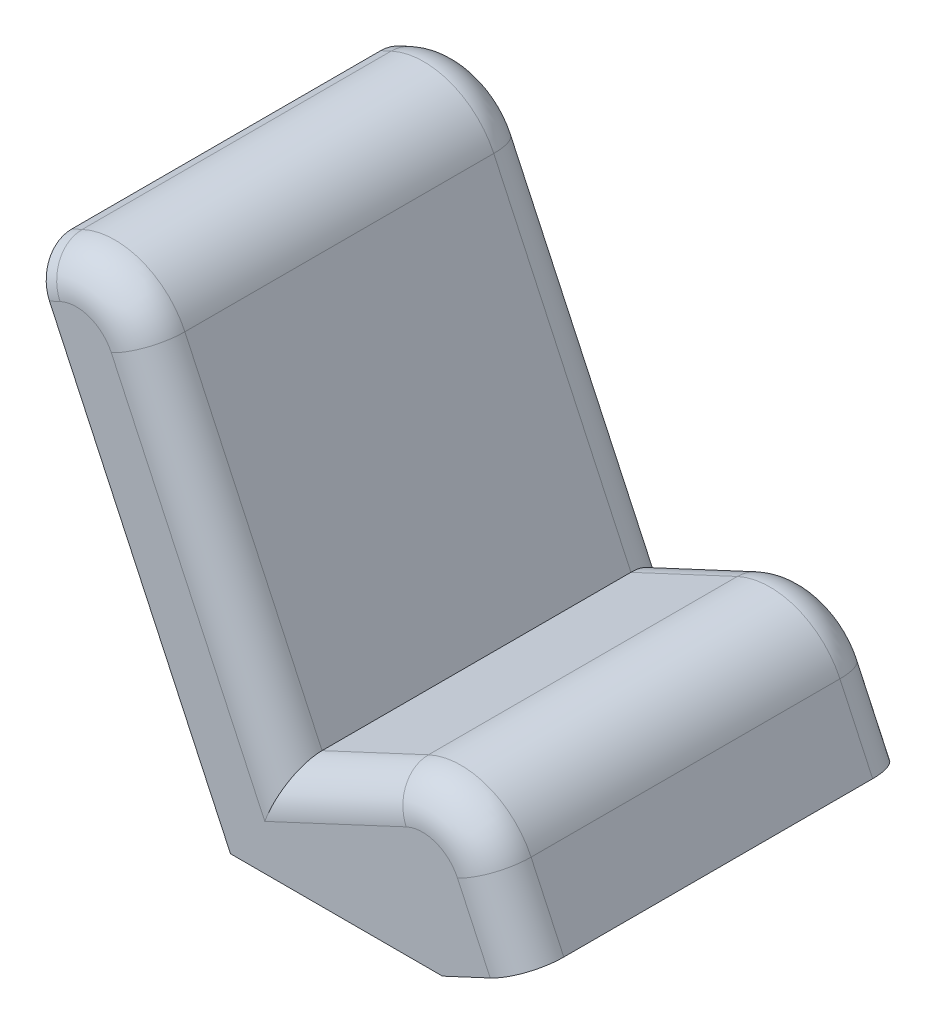
ISO-10303-21;
HEADER;
FILE_DESCRIPTION(('STEP AP214'),'2;1');
FILE_NAME('part.step','',(''),(''),'','','');
FILE_SCHEMA(('AUTOMOTIVE_DESIGN { 1 0 10303 214 1 1 1 1 }'));
ENDSEC;
DATA;
#1=APPLICATION_CONTEXT('core data for automotive mechanical design processes');
#2=APPLICATION_PROTOCOL_DEFINITION('international standard','automotive_design',2000,#1);
#3=PRODUCT_CONTEXT('',#1,'mechanical');
#4=PRODUCT('Part','Part','',(#3));
#5=PRODUCT_RELATED_PRODUCT_CATEGORY('part','',(#4));
#6=PRODUCT_DEFINITION_FORMATION('','',#4);
#7=PRODUCT_DEFINITION_CONTEXT('part definition',#1,'design');
#8=PRODUCT_DEFINITION('design','',#6,#7);
#9=PRODUCT_DEFINITION_SHAPE('','',#8);
#10=(LENGTH_UNIT() NAMED_UNIT(*) SI_UNIT(.MILLI.,.METRE.));
#11=(NAMED_UNIT(*) PLANE_ANGLE_UNIT() SI_UNIT($,.RADIAN.));
#12=(NAMED_UNIT(*) SI_UNIT($,.STERADIAN.) SOLID_ANGLE_UNIT());
#13=UNCERTAINTY_MEASURE_WITH_UNIT(LENGTH_MEASURE(1.E-05),#10,'distance_accuracy_value','');
#14=(GEOMETRIC_REPRESENTATION_CONTEXT(3) GLOBAL_UNCERTAINTY_ASSIGNED_CONTEXT((#13)) GLOBAL_UNIT_ASSIGNED_CONTEXT((#10,
#11,#12)) REPRESENTATION_CONTEXT('',''));
#15=CARTESIAN_POINT('',(0.,0.,0.));
#16=DIRECTION('',(0.,0.,1.));
#17=DIRECTION('',(1.,0.,0.));
#18=AXIS2_PLACEMENT_3D('',#15,#16,#17);
#19=CARTESIAN_POINT('',(-46.182652473701,110.870025753101,50.));
#20=DIRECTION('',(0.4226182617407,-0.906307787036649,0.));
#21=DIRECTION('',(0.906307787036649,0.4226182617407,0.));
#22=AXIS2_PLACEMENT_3D('',#19,#20,#21);
#23=PLANE('',#22);
#24=DIRECTION('',(-0.906307787036649,-0.4226182617407,0.));
#25=VECTOR('',#24,1.);
#26=CARTESIAN_POINT('',(-46.182652473701,110.870025753101,-40.));
#27=LINE('',#26,#25);
#28=CARTESIAN_POINT('',(-46.182652473701,110.870025753101,-40.));
#29=VERTEX_POINT('',#28);
#30=CARTESIAN_POINT('',(-48.9015758348108,109.602170967879,-40.));
#31=VERTEX_POINT('',#30);
#32=EDGE_CURVE('E281',#29,#31,#27,.T.);
#33=ORIENTED_EDGE('',*,*,#32,.T.);
#34=DIRECTION('',(0.,0.,1.));
#35=VECTOR('',#34,1.);
#36=CARTESIAN_POINT('',(-48.9015758348108,109.602170967879,50.));
#37=LINE('',#36,#35);
#38=CARTESIAN_POINT('',(-48.9015758348108,109.602170967879,40.));
#39=VERTEX_POINT('',#38);
#40=EDGE_CURVE('E13',#31,#39,#37,.T.);
#41=ORIENTED_EDGE('',*,*,#40,.T.);
#42=DIRECTION('',(-0.906307787036649,-0.4226182617407,0.));
#43=VECTOR('',#42,1.);
#44=CARTESIAN_POINT('',(-46.182652473701,110.870025753101,40.));
#45=LINE('',#44,#43);
#46=CARTESIAN_POINT('',(-46.182652473701,110.870025753101,40.));
#47=VERTEX_POINT('',#46);
#48=EDGE_CURVE('E279',#39,#47,#45,.F.);
#49=ORIENTED_EDGE('',*,*,#48,.T.);
#50=DIRECTION('',(0.,0.,-1.));
#51=VECTOR('',#50,1.);
#52=CARTESIAN_POINT('',(-46.182652473701,110.870025753101,50.));
#53=LINE('',#52,#51);
#54=EDGE_CURVE('E215',#47,#29,#53,.T.);
#55=ORIENTED_EDGE('',*,*,#54,.T.);
#56=EDGE_LOOP('',(#33,#41,#49,#55));
#57=FACE_BOUND('',#56,.T.);
#58=ADVANCED_FACE('F53',(#57),#23,.F.);
#59=CARTESIAN_POINT('',(-50.7141914088841,108.756934444398,50.));
#60=DIRECTION('',(0.906307787036649,0.422618261740701,0.));
#61=DIRECTION('',(-0.422618261740701,0.906307787036649,0.));
#62=AXIS2_PLACEMENT_3D('',#59,#60,#61);
#63=PLANE('',#62);
#64=DIRECTION('',(0.,0.,-1.));
#65=VECTOR('',#64,1.);
#66=CARTESIAN_POINT('',(0.,0.,50.));
#67=LINE('',#66,#65);
#68=CARTESIAN_POINT('',(0.,0.,48.));
#69=VERTEX_POINT('',#68);
#70=CARTESIAN_POINT('',(0.,0.,-48.));
#71=VERTEX_POINT('',#70);
#72=EDGE_CURVE('E208',#69,#71,#67,.T.);
#73=ORIENTED_EDGE('',*,*,#72,.F.);
#74=DIRECTION('',(-0.422618261740701,0.906307787036649,0.));
#75=VECTOR('',#74,1.);
#76=CARTESIAN_POINT('',(-46.4880087914771,99.6938565740314,48.));
#77=LINE('',#76,#75);
#78=CARTESIAN_POINT('',(-46.4880087914771,99.6938565740314,48.));
#79=VERTEX_POINT('',#78);
#80=EDGE_CURVE('E336',#69,#79,#77,.T.);
#81=ORIENTED_EDGE('',*,*,#80,.T.);
#82=CARTESIAN_POINT('',(-46.4880087914771,99.6938565740314,40.));
#83=DIRECTION('',(0.906307787036649,0.422618261740701,0.));
#84=DIRECTION('',(-0.422618261740701,0.906307787036649,0.));
#85=AXIS2_PLACEMENT_3D('',#82,#83,#84);
#86=CIRCLE('',#85,7.99999999999998);
#87=CARTESIAN_POINT('',(-49.8689548854027,106.944318870325,40.));
#88=VERTEX_POINT('',#87);
#89=EDGE_CURVE('E332',#79,#88,#86,.F.);
#90=ORIENTED_EDGE('',*,*,#89,.T.);
#91=DIRECTION('',(0.,0.,-1.));
#92=VECTOR('',#91,1.);
#93=CARTESIAN_POINT('',(-49.8689548854027,106.944318870325,50.));
#94=LINE('',#93,#92);
#95=CARTESIAN_POINT('',(-49.8689548854027,106.944318870325,-40.));
#96=VERTEX_POINT('',#95);
#97=EDGE_CURVE('E328',#88,#96,#94,.T.);
#98=ORIENTED_EDGE('',*,*,#97,.T.);
#99=CARTESIAN_POINT('',(-46.4880087914771,99.6938565740314,-40.));
#100=DIRECTION('',(0.906307787036649,0.422618261740701,0.));
#101=DIRECTION('',(-0.422618261740701,0.906307787036649,0.));
#102=AXIS2_PLACEMENT_3D('',#99,#100,#101);
#103=CIRCLE('',#102,7.99999999999999);
#104=CARTESIAN_POINT('',(-46.4880087914771,99.6938565740314,-48.));
#105=VERTEX_POINT('',#104);
#106=EDGE_CURVE('E330',#96,#105,#103,.F.);
#107=ORIENTED_EDGE('',*,*,#106,.T.);
#108=DIRECTION('',(0.422618261740701,-0.906307787036649,0.));
#109=VECTOR('',#108,1.);
#110=CARTESIAN_POINT('',(-50.7141914088841,108.756934444398,-48.));
#111=LINE('',#110,#109);
#112=EDGE_CURVE('E334',#105,#71,#111,.T.);
#113=ORIENTED_EDGE('',*,*,#112,.T.);
#114=EDGE_LOOP('',(#73,#81,#90,#98,#107,#113));
#115=FACE_BOUND('',#114,.T.);
#116=ADVANCED_FACE('F364',(#115),#63,.F.);
#117=CARTESIAN_POINT('',(0.,0.,50.));
#118=DIRECTION('',(0.,1.,0.));
#119=DIRECTION('',(0.,0.,1.));
#120=AXIS2_PLACEMENT_3D('',#117,#118,#119);
#121=PLANE('',#120);
#122=CARTESIAN_POINT('',(30.,0.,0.));
#123=DIRECTION('',(0.,1.,0.));
#124=DIRECTION('',(0.,0.,1.));
#125=AXIS2_PLACEMENT_3D('',#122,#123,#124);
#126=CIRCLE('',#125,7.5);
#127=CARTESIAN_POINT('',(30.,0.,7.5));
#128=VERTEX_POINT('',#127);
#129=EDGE_CURVE('E240',#128,#128,#126,.F.);
#130=ORIENTED_EDGE('',*,*,#129,.F.);
#131=EDGE_LOOP('',(#130));
#132=FACE_BOUND('',#131,.T.);
#133=DIRECTION('',(1.,0.,0.));
#134=VECTOR('',#133,1.);
#135=CARTESIAN_POINT('',(0.,0.,50.));
#136=LINE('',#135,#134);
#137=CARTESIAN_POINT('',(2.20675583792498,0.,50.));
#138=VERTEX_POINT('',#137);
#139=CARTESIAN_POINT('',(57.1,0.,50.));
#140=VERTEX_POINT('',#139);
#141=EDGE_CURVE('E187',#138,#140,#136,.T.);
#142=ORIENTED_EDGE('',*,*,#141,.F.);
#143=DIRECTION('',(-0.740965645273288,0.,-0.671542934237819));
#144=VECTOR('',#143,1.);
#145=CARTESIAN_POINT('',(2.93547623419733,0.,50.6604449697141));
#146=LINE('',#145,#144);
#147=EDGE_CURVE('E326',#138,#69,#146,.T.);
#148=ORIENTED_EDGE('',*,*,#147,.T.);
#149=ORIENTED_EDGE('',*,*,#72,.T.);
#150=DIRECTION('',(-0.740965645273289,0.,0.671542934237818));
#151=VECTOR('',#150,1.);
#152=CARTESIAN_POINT('',(-27.8436169454568,0.,-22.7651131430669));
#153=LINE('',#152,#151);
#154=CARTESIAN_POINT('',(2.20675583792498,0.,-50.));
#155=VERTEX_POINT('',#154);
#156=EDGE_CURVE('E324',#71,#155,#153,.F.);
#157=ORIENTED_EDGE('',*,*,#156,.T.);
#158=DIRECTION('',(1.,0.,0.));
#159=VECTOR('',#158,1.);
#160=CARTESIAN_POINT('',(0.,0.,-50.));
#161=LINE('',#160,#159);
#162=CARTESIAN_POINT('',(57.1,0.,-50.));
#163=VERTEX_POINT('',#162);
#164=EDGE_CURVE('E204',#155,#163,#161,.T.);
#165=ORIENTED_EDGE('',*,*,#164,.T.);
#166=DIRECTION('',(0.,0.,-1.));
#167=VECTOR('',#166,1.);
#168=CARTESIAN_POINT('',(57.1,0.,50.));
#169=LINE('',#168,#167);
#170=EDGE_CURVE('E201',#140,#163,#169,.T.);
#171=ORIENTED_EDGE('',*,*,#170,.F.);
#172=EDGE_LOOP('',(#142,#148,#149,#157,#165,#171));
#173=FACE_BOUND('',#172,.T.);
#174=ADVANCED_FACE('F202',(#132,#173),#121,.F.);
#175=CARTESIAN_POINT('',(57.1,0.,50.));
#176=DIRECTION('',(-0.422618261740701,0.906307787036649,0.));
#177=DIRECTION('',(-0.906307787036649,-0.422618261740701,0.));
#178=AXIS2_PLACEMENT_3D('',#175,#176,#177);
#179=PLANE('',#178);
#180=DIRECTION('',(0.906307787036649,0.422618261740701,0.));
#181=VECTOR('',#180,1.);
#182=CARTESIAN_POINT('',(57.1,0.,-50.));
#183=LINE('',#182,#181);
#184=CARTESIAN_POINT('',(69.481991334729,5.77381738259299,-50.));
#185=VERTEX_POINT('',#184);
#186=EDGE_CURVE('E198',#163,#185,#183,.T.);
#187=ORIENTED_EDGE('',*,*,#186,.T.);
#188=CARTESIAN_POINT('',(69.481991334729,5.77381738259299,-40.));
#189=DIRECTION('',(-0.422618261740701,0.906307787036649,0.));
#190=DIRECTION('',(-0.906307787036649,-0.422618261740701,0.));
#191=AXIS2_PLACEMENT_3D('',#188,#189,#190);
#192=CIRCLE('',#191,10.);
#193=CARTESIAN_POINT('',(78.5450692050955,10.,-40.));
#194=VERTEX_POINT('',#193);
#195=EDGE_CURVE('E261',#185,#194,#192,.F.);
#196=ORIENTED_EDGE('',*,*,#195,.T.);
#197=DIRECTION('',(0.,0.,-1.));
#198=VECTOR('',#197,1.);
#199=CARTESIAN_POINT('',(78.5450692050955,10.,50.));
#200=LINE('',#199,#198);
#201=CARTESIAN_POINT('',(78.5450692050955,10.,40.));
#202=VERTEX_POINT('',#201);
#203=EDGE_CURVE('E209',#202,#194,#200,.T.);
#204=ORIENTED_EDGE('',*,*,#203,.F.);
#205=CARTESIAN_POINT('',(69.481991334729,5.77381738259299,40.));
#206=DIRECTION('',(-0.422618261740701,0.906307787036649,0.));
#207=DIRECTION('',(-0.906307787036649,-0.422618261740701,0.));
#208=AXIS2_PLACEMENT_3D('',#205,#206,#207);
#209=CIRCLE('',#208,10.);
#210=CARTESIAN_POINT('',(69.481991334729,5.77381738259299,50.));
#211=VERTEX_POINT('',#210);
#212=EDGE_CURVE('E214',#202,#211,#209,.F.);
#213=ORIENTED_EDGE('',*,*,#212,.T.);
#214=DIRECTION('',(0.906307787036649,0.422618261740701,0.));
#215=VECTOR('',#214,1.);
#216=CARTESIAN_POINT('',(57.1,0.,50.));
#217=LINE('',#216,#215);
#218=EDGE_CURVE('E193',#140,#211,#217,.T.);
#219=ORIENTED_EDGE('',*,*,#218,.F.);
#220=ORIENTED_EDGE('',*,*,#170,.T.);
#221=EDGE_LOOP('',(#187,#196,#204,#213,#219,#220));
#222=FACE_BOUND('',#221,.T.);
#223=ADVANCED_FACE('F211',(#222),#179,.F.);
#224=CARTESIAN_POINT('',(78.5450692050955,10.,50.));
#225=DIRECTION('',(-0.906307787036649,-0.422618261740702,0.));
#226=DIRECTION('',(0.422618261740702,-0.906307787036649,0.));
#227=AXIS2_PLACEMENT_3D('',#224,#225,#226);
#228=PLANE('',#227);
#229=ORIENTED_EDGE('',*,*,#203,.T.);
#230=DIRECTION('',(-0.422618261740702,0.906307787036649,0.));
#231=VECTOR('',#230,1.);
#232=CARTESIAN_POINT('',(78.5450692050955,10.,-40.));
#233=LINE('',#232,#231);
#234=CARTESIAN_POINT('',(70.0680825407312,28.1789565667964,-40.));
#235=VERTEX_POINT('',#234);
#236=EDGE_CURVE('E245',#194,#235,#233,.T.);
#237=ORIENTED_EDGE('',*,*,#236,.T.);
#238=DIRECTION('',(0.,0.,-1.));
#239=VECTOR('',#238,1.);
#240=CARTESIAN_POINT('',(70.0680825407312,28.1789565667964,50.));
#241=LINE('',#240,#239);
#242=CARTESIAN_POINT('',(70.0680825407312,28.1789565667964,40.));
#243=VERTEX_POINT('',#242);
#244=EDGE_CURVE('E233',#243,#235,#241,.T.);
#245=ORIENTED_EDGE('',*,*,#244,.F.);
#246=DIRECTION('',(-0.422618261740702,0.906307787036649,0.));
#247=VECTOR('',#246,1.);
#248=CARTESIAN_POINT('',(78.5450692050955,10.,40.));
#249=LINE('',#248,#247);
#250=EDGE_CURVE('E243',#243,#202,#249,.F.);
#251=ORIENTED_EDGE('',*,*,#250,.T.);
#252=EDGE_LOOP('',(#229,#237,#245,#251));
#253=FACE_BOUND('',#252,.T.);
#254=ADVANCED_FACE('F629',(#253),#228,.F.);
#255=CARTESIAN_POINT('',(51.9419267999982,19.7265913319824,50.));
#256=DIRECTION('',(0.,0.,-1.));
#257=DIRECTION('',(-1.,0.,0.));
#258=AXIS2_PLACEMENT_3D('',#255,#256,#257);
#259=CYLINDRICAL_SURFACE('',#258,20.);
#260=ORIENTED_EDGE('',*,*,#244,.T.);
#261=CARTESIAN_POINT('',(51.9419267999982,19.7265913319824,-40.));
#262=DIRECTION('',(0.,0.,1.));
#263=DIRECTION('',(1.,0.,0.));
#264=AXIS2_PLACEMENT_3D('',#261,#262,#263);
#265=CIRCLE('',#264,20.);
#266=CARTESIAN_POINT('',(43.4895615651841,37.8527470727154,-40.));
#267=VERTEX_POINT('',#266);
#268=EDGE_CURVE('E289',#235,#267,#265,.T.);
#269=ORIENTED_EDGE('',*,*,#268,.T.);
#270=DIRECTION('',(0.,0.,-1.));
#271=VECTOR('',#270,1.);
#272=CARTESIAN_POINT('',(43.4895615651841,37.8527470727154,50.));
#273=LINE('',#272,#271);
#274=CARTESIAN_POINT('',(43.4895615651841,37.8527470727154,40.));
#275=VERTEX_POINT('',#274);
#276=EDGE_CURVE('E230',#275,#267,#273,.T.);
#277=ORIENTED_EDGE('',*,*,#276,.F.);
#278=CARTESIAN_POINT('',(51.9419267999982,19.7265913319824,40.));
#279=DIRECTION('',(0.,0.,1.));
#280=DIRECTION('',(1.,0.,0.));
#281=AXIS2_PLACEMENT_3D('',#278,#279,#280);
#282=CIRCLE('',#281,20.);
#283=EDGE_CURVE('E287',#275,#243,#282,.F.);
#284=ORIENTED_EDGE('',*,*,#283,.T.);
#285=EDGE_LOOP('',(#260,#269,#277,#284));
#286=FACE_BOUND('',#285,.T.);
#287=ADVANCED_FACE('F619',(#286),#259,.T.);
#288=CARTESIAN_POINT('',(43.4895615651841,37.8527470727153,50.));
#289=DIRECTION('',(0.422618261740702,-0.906307787036649,0.));
#290=DIRECTION('',(0.906307787036649,0.422618261740702,0.));
#291=AXIS2_PLACEMENT_3D('',#288,#289,#290);
#292=PLANE('',#291);
#293=ORIENTED_EDGE('',*,*,#276,.T.);
#294=DIRECTION('',(-0.906307787036649,-0.422618261740702,0.));
#295=VECTOR('',#294,1.);
#296=CARTESIAN_POINT('',(43.4895615651841,37.8527470727153,-40.));
#297=LINE('',#296,#295);
#298=CARTESIAN_POINT('',(15.9267565201873,25.,-40.));
#299=VERTEX_POINT('',#298);
#300=EDGE_CURVE('E265',#267,#299,#297,.T.);
#301=ORIENTED_EDGE('',*,*,#300,.T.);
#302=DIRECTION('',(0.,0.,-1.));
#303=VECTOR('',#302,1.);
#304=CARTESIAN_POINT('',(15.9267565201873,25.,50.));
#305=LINE('',#304,#303);
#306=CARTESIAN_POINT('',(15.9267565201873,25.,40.));
#307=VERTEX_POINT('',#306);
#308=EDGE_CURVE('E227',#307,#299,#305,.T.);
#309=ORIENTED_EDGE('',*,*,#308,.F.);
#310=DIRECTION('',(-0.906307787036649,-0.422618261740702,0.));
#311=VECTOR('',#310,1.);
#312=CARTESIAN_POINT('',(43.4895615651841,37.8527470727153,40.));
#313=LINE('',#312,#311);
#314=EDGE_CURVE('E263',#307,#275,#313,.F.);
#315=ORIENTED_EDGE('',*,*,#314,.T.);
#316=EDGE_LOOP('',(#293,#301,#309,#315));
#317=FACE_BOUND('',#316,.T.);
#318=ADVANCED_FACE('F609',(#317),#292,.F.);
#319=CARTESIAN_POINT('',(15.9267565201873,25.,50.));
#320=DIRECTION('',(-0.906307787036649,-0.422618261740701,0.));
#321=DIRECTION('',(0.422618261740701,-0.906307787036649,0.));
#322=AXIS2_PLACEMENT_3D('',#319,#320,#321);
#323=PLANE('',#322);
#324=ORIENTED_EDGE('',*,*,#308,.T.);
#325=DIRECTION('',(-0.422618261740701,0.906307787036649,0.));
#326=VECTOR('',#325,1.);
#327=CARTESIAN_POINT('',(15.9267565201873,25.,-40.));
#328=LINE('',#327,#326);
#329=CARTESIAN_POINT('',(-19.6041314981538,101.196235247182,-40.));
#330=VERTEX_POINT('',#329);
#331=EDGE_CURVE('E293',#299,#330,#328,.T.);
#332=ORIENTED_EDGE('',*,*,#331,.T.);
#333=DIRECTION('',(0.,0.,-1.));
#334=VECTOR('',#333,1.);
#335=CARTESIAN_POINT('',(-19.6041314981538,101.196235247182,50.));
#336=LINE('',#335,#334);
#337=CARTESIAN_POINT('',(-19.6041314981538,101.196235247182,40.));
#338=VERTEX_POINT('',#337);
#339=EDGE_CURVE('E218',#338,#330,#336,.T.);
#340=ORIENTED_EDGE('',*,*,#339,.F.);
#341=DIRECTION('',(-0.422618261740701,0.906307787036649,0.));
#342=VECTOR('',#341,1.);
#343=CARTESIAN_POINT('',(15.9267565201873,25.,40.));
#344=LINE('',#343,#342);
#345=EDGE_CURVE('E291',#338,#307,#344,.F.);
#346=ORIENTED_EDGE('',*,*,#345,.T.);
#347=EDGE_LOOP('',(#324,#332,#340,#346));
#348=FACE_BOUND('',#347,.T.);
#349=ADVANCED_FACE('F599',(#348),#323,.F.);
#350=CARTESIAN_POINT('',(-37.7302872388869,92.7438700123684,50.));
#351=DIRECTION('',(0.,0.,-1.));
#352=DIRECTION('',(-1.,0.,0.));
#353=AXIS2_PLACEMENT_3D('',#350,#351,#352);
#354=CYLINDRICAL_SURFACE('',#353,20.);
#355=ORIENTED_EDGE('',*,*,#339,.T.);
#356=CARTESIAN_POINT('',(-37.7302872388869,92.7438700123684,-40.));
#357=DIRECTION('',(0.,0.,1.));
#358=DIRECTION('',(1.,0.,0.));
#359=AXIS2_PLACEMENT_3D('',#356,#357,#358);
#360=CIRCLE('',#359,20.);
#361=EDGE_CURVE('E285',#330,#29,#360,.T.);
#362=ORIENTED_EDGE('',*,*,#361,.T.);
#363=ORIENTED_EDGE('',*,*,#54,.F.);
#364=CARTESIAN_POINT('',(-37.7302872388869,92.7438700123684,40.));
#365=DIRECTION('',(0.,0.,1.));
#366=DIRECTION('',(1.,0.,0.));
#367=AXIS2_PLACEMENT_3D('',#364,#365,#366);
#368=CIRCLE('',#367,20.);
#369=EDGE_CURVE('E283',#47,#338,#368,.F.);
#370=ORIENTED_EDGE('',*,*,#369,.T.);
#371=EDGE_LOOP('',(#355,#362,#363,#370));
#372=FACE_BOUND('',#371,.T.);
#373=ADVANCED_FACE('F590',(#372),#354,.T.);
#374=CARTESIAN_POINT('',(51.9419267999982,19.7265913319824,50.));
#375=DIRECTION('',(0.,0.,1.));
#376=DIRECTION('',(1.,0.,0.));
#377=AXIS2_PLACEMENT_3D('',#374,#375,#376);
#378=PLANE('',#377);
#379=DIRECTION('',(-0.906307787036649,-0.4226182617407,0.));
#380=VECTOR('',#379,1.);
#381=CARTESIAN_POINT('',(-46.4880087914771,99.6938565740314,50.));
#382=LINE('',#381,#380);
#383=CARTESIAN_POINT('',(-41.956469856294,101.806947882735,50.));
#384=VERTEX_POINT('',#383);
#385=CARTESIAN_POINT('',(-44.6753932174038,100.539093097513,50.));
#386=VERTEX_POINT('',#385);
#387=EDGE_CURVE('E271',#384,#386,#382,.T.);
#388=ORIENTED_EDGE('',*,*,#387,.T.);
#389=DIRECTION('',(0.422618261740701,-0.906307787036649,0.));
#390=VECTOR('',#389,1.);
#391=CARTESIAN_POINT('',(1.81261557407329,0.845236523481399,50.));
#392=LINE('',#391,#390);
#393=EDGE_CURVE('E196',#386,#138,#392,.T.);
#394=ORIENTED_EDGE('',*,*,#393,.T.);
#395=ORIENTED_EDGE('',*,*,#141,.T.);
#396=ORIENTED_EDGE('',*,*,#218,.T.);
#397=DIRECTION('',(-0.422618261740702,0.906307787036649,0.));
#398=VECTOR('',#397,1.);
#399=CARTESIAN_POINT('',(61.0050046703647,23.9527739493894,50.));
#400=LINE('',#399,#398);
#401=CARTESIAN_POINT('',(61.0050046703647,23.9527739493894,50.));
#402=VERTEX_POINT('',#401);
#403=EDGE_CURVE('E277',#211,#402,#400,.T.);
#404=ORIENTED_EDGE('',*,*,#403,.T.);
#405=CARTESIAN_POINT('',(51.9419267999982,19.7265913319824,50.));
#406=DIRECTION('',(0.,0.,1.));
#407=DIRECTION('',(1.,0.,0.));
#408=AXIS2_PLACEMENT_3D('',#405,#406,#407);
#409=CIRCLE('',#408,10.);
#410=CARTESIAN_POINT('',(47.7157441825912,28.7896692023489,50.));
#411=VERTEX_POINT('',#410);
#412=EDGE_CURVE('E275',#402,#411,#409,.T.);
#413=ORIENTED_EDGE('',*,*,#412,.T.);
#414=DIRECTION('',(-0.906307787036649,-0.422618261740702,0.));
#415=VECTOR('',#414,1.);
#416=CARTESIAN_POINT('',(20.1529391375943,15.9369221296335,50.));
#417=LINE('',#416,#415);
#418=CARTESIAN_POINT('',(11.0898612672278,11.7107395122265,50.));
#419=VERTEX_POINT('',#418);
#420=EDGE_CURVE('E273',#411,#419,#417,.T.);
#421=ORIENTED_EDGE('',*,*,#420,.T.);
#422=DIRECTION('',(-0.422618261740701,0.906307787036649,0.));
#423=VECTOR('',#422,1.);
#424=CARTESIAN_POINT('',(-28.6672093685203,96.9700526297754,50.));
#425=LINE('',#424,#423);
#426=CARTESIAN_POINT('',(-28.6672093685204,96.9700526297754,50.));
#427=VERTEX_POINT('',#426);
#428=EDGE_CURVE('E267',#419,#427,#425,.T.);
#429=ORIENTED_EDGE('',*,*,#428,.T.);
#430=CARTESIAN_POINT('',(-37.7302872388869,92.7438700123684,50.));
#431=DIRECTION('',(0.,0.,1.));
#432=DIRECTION('',(1.,0.,0.));
#433=AXIS2_PLACEMENT_3D('',#430,#431,#432);
#434=CIRCLE('',#433,10.);
#435=EDGE_CURVE('E269',#427,#384,#434,.T.);
#436=ORIENTED_EDGE('',*,*,#435,.T.);
#437=EDGE_LOOP('',(#388,#394,#395,#396,#404,#413,#421,#429,#436));
#438=FACE_BOUND('',#437,.T.);
#439=ADVANCED_FACE('F190',(#438),#378,.T.);
#440=CARTESIAN_POINT('',(51.9419267999982,19.7265913319824,-50.));
#441=DIRECTION('',(0.,0.,1.));
#442=DIRECTION('',(1.,0.,0.));
#443=AXIS2_PLACEMENT_3D('',#440,#441,#442);
#444=PLANE('',#443);
#445=ORIENTED_EDGE('',*,*,#164,.F.);
#446=DIRECTION('',(-0.422618261740701,0.906307787036649,0.));
#447=VECTOR('',#446,1.);
#448=CARTESIAN_POINT('',(3.53404265315836,-2.84637576076909,-50.));
#449=LINE('',#448,#447);
#450=CARTESIAN_POINT('',(-44.6753932174038,100.539093097513,-50.));
#451=VERTEX_POINT('',#450);
#452=EDGE_CURVE('E338',#155,#451,#449,.T.);
#453=ORIENTED_EDGE('',*,*,#452,.T.);
#454=DIRECTION('',(-0.906307787036649,-0.4226182617407,0.));
#455=VECTOR('',#454,1.);
#456=CARTESIAN_POINT('',(3.73249092943605,123.112060190264,-50.));
#457=LINE('',#456,#455);
#458=CARTESIAN_POINT('',(-41.956469856294,101.806947882735,-50.));
#459=VERTEX_POINT('',#458);
#460=EDGE_CURVE('E252',#451,#459,#457,.F.);
#461=ORIENTED_EDGE('',*,*,#460,.T.);
#462=CARTESIAN_POINT('',(-37.7302872388869,92.7438700123684,-50.));
#463=DIRECTION('',(0.,0.,1.));
#464=DIRECTION('',(1.,0.,0.));
#465=AXIS2_PLACEMENT_3D('',#462,#463,#464);
#466=CIRCLE('',#465,10.);
#467=CARTESIAN_POINT('',(-28.6672093685203,96.9700526297754,-50.));
#468=VERTEX_POINT('',#467);
#469=EDGE_CURVE('E250',#459,#468,#466,.F.);
#470=ORIENTED_EDGE('',*,*,#469,.T.);
#471=DIRECTION('',(-0.422618261740701,0.906307787036649,0.));
#472=VECTOR('',#471,1.);
#473=CARTESIAN_POINT('',(15.3160438846348,2.64766164186003,-50.));
#474=LINE('',#473,#472);
#475=CARTESIAN_POINT('',(11.0898612672278,11.7107395122265,-50.));
#476=VERTEX_POINT('',#475);
#477=EDGE_CURVE('E248',#468,#476,#474,.F.);
#478=ORIENTED_EDGE('',*,*,#477,.T.);
#479=DIRECTION('',(-0.906307787036649,-0.422618261740702,0.));
#480=VECTOR('',#479,1.);
#481=CARTESIAN_POINT('',(47.7157441825911,28.7896692023489,-50.));
#482=LINE('',#481,#480);
#483=CARTESIAN_POINT('',(47.7157441825912,28.7896692023489,-50.));
#484=VERTEX_POINT('',#483);
#485=EDGE_CURVE('E254',#476,#484,#482,.F.);
#486=ORIENTED_EDGE('',*,*,#485,.T.);
#487=CARTESIAN_POINT('',(51.9419267999982,19.7265913319824,-50.));
#488=DIRECTION('',(0.,0.,1.));
#489=DIRECTION('',(1.,0.,0.));
#490=AXIS2_PLACEMENT_3D('',#487,#488,#489);
#491=CIRCLE('',#490,10.);
#492=CARTESIAN_POINT('',(61.0050046703647,23.9527739493894,-50.));
#493=VERTEX_POINT('',#492);
#494=EDGE_CURVE('E256',#484,#493,#491,.F.);
#495=ORIENTED_EDGE('',*,*,#494,.T.);
#496=DIRECTION('',(-0.422618261740702,0.906307787036649,0.));
#497=VECTOR('',#496,1.);
#498=CARTESIAN_POINT('',(61.0050046703647,23.9527739493894,-50.));
#499=LINE('',#498,#497);
#500=EDGE_CURVE('E258',#493,#185,#499,.F.);
#501=ORIENTED_EDGE('',*,*,#500,.T.);
#502=ORIENTED_EDGE('',*,*,#186,.F.);
#503=EDGE_LOOP('',(#445,#453,#461,#470,#478,#486,#495,#501,#502));
#504=FACE_BOUND('',#503,.T.);
#505=ADVANCED_FACE('F572',(#504),#444,.F.);
#506=CARTESIAN_POINT('',(30.,-10.,0.));
#507=DIRECTION('',(0.,1.,0.));
#508=DIRECTION('',(0.,0.,1.));
#509=AXIS2_PLACEMENT_3D('',#506,#507,#508);
#510=CYLINDRICAL_SURFACE('',#509,7.5);
#511=CARTESIAN_POINT('',(30.,-10.,0.));
#512=DIRECTION('',(0.,-1.,0.));
#513=DIRECTION('',(0.,0.,-1.));
#514=AXIS2_PLACEMENT_3D('',#511,#512,#513);
#515=CIRCLE('',#514,7.5);
#516=CARTESIAN_POINT('',(30.,-10.,-7.5));
#517=VERTEX_POINT('',#516);
#518=EDGE_CURVE('E223',#517,#517,#515,.T.);
#519=ORIENTED_EDGE('',*,*,#518,.F.);
#520=EDGE_LOOP('',(#519));
#521=FACE_BOUND('',#520,.T.);
#522=ORIENTED_EDGE('',*,*,#129,.T.);
#523=EDGE_LOOP('',(#522));
#524=FACE_BOUND('',#523,.T.);
#525=ADVANCED_FACE('F561',(#521,#524),#510,.T.);
#526=CARTESIAN_POINT('',(30.,-10.,0.));
#527=DIRECTION('',(0.,-1.,0.));
#528=DIRECTION('',(0.,0.,-1.));
#529=AXIS2_PLACEMENT_3D('',#526,#527,#528);
#530=PLANE('',#529);
#531=ORIENTED_EDGE('',*,*,#518,.T.);
#532=EDGE_LOOP('',(#531));
#533=FACE_BOUND('',#532,.T.);
#534=ADVANCED_FACE('F416',(#533),#530,.T.);
#535=CARTESIAN_POINT('',(-41.956469856294,101.806947882735,-40.));
#536=DIRECTION('',(-0.906307787036649,-0.4226182617407,0.));
#537=DIRECTION('',(0.4226182617407,-0.906307787036649,0.));
#538=AXIS2_PLACEMENT_3D('',#535,#536,#537);
#539=CYLINDRICAL_SURFACE('',#538,10.);
#540=ORIENTED_EDGE('',*,*,#460,.F.);
#541=CARTESIAN_POINT('',(-44.6753932174038,100.539093097513,-40.));
#542=DIRECTION('',(0.90630778703665,0.422618261740698,0.));
#543=DIRECTION('',(-0.422618261740698,0.90630778703665,0.));
#544=AXIS2_PLACEMENT_3D('',#541,#542,#543);
#545=CIRCLE('',#544,10.);
#546=EDGE_CURVE('E63',#451,#31,#545,.T.);
#547=ORIENTED_EDGE('',*,*,#546,.T.);
#548=ORIENTED_EDGE('',*,*,#32,.F.);
#549=CARTESIAN_POINT('',(-41.956469856294,101.806947882735,-40.));
#550=DIRECTION('',(0.906307787036649,0.4226182617407,0.));
#551=DIRECTION('',(-0.422618261740701,0.90630778703665,0.));
#552=AXIS2_PLACEMENT_3D('',#549,#550,#551);
#553=CIRCLE('',#552,10.);
#554=EDGE_CURVE('E307',#459,#29,#553,.T.);
#555=ORIENTED_EDGE('',*,*,#554,.F.);
#556=EDGE_LOOP('',(#540,#547,#548,#555));
#557=FACE_BOUND('',#556,.T.);
#558=ADVANCED_FACE('F412',(#557),#539,.T.);
#559=CARTESIAN_POINT('',(-37.7302872388869,92.7438700123684,-40.));
#560=DIRECTION('',(0.,0.,1.));
#561=DIRECTION('',(1.,0.,0.));
#562=AXIS2_PLACEMENT_3D('',#559,#560,#561);
#563=DEGENERATE_TOROIDAL_SURFACE('',#562,10.,10.,.T.);
#564=ORIENTED_EDGE('',*,*,#554,.T.);
#565=ORIENTED_EDGE('',*,*,#361,.F.);
#566=CARTESIAN_POINT('',(-28.6672093685203,96.9700526297754,-40.));
#567=DIRECTION('',(0.422618261740695,-0.906307787036652,0.));
#568=DIRECTION('',(0.906307787036652,0.422618261740695,0.));
#569=AXIS2_PLACEMENT_3D('',#566,#567,#568);
#570=CIRCLE('',#569,10.);
#571=EDGE_CURVE('E304',#468,#330,#570,.T.);
#572=ORIENTED_EDGE('',*,*,#571,.F.);
#573=ORIENTED_EDGE('',*,*,#469,.F.);
#574=EDGE_LOOP('',(#564,#565,#572,#573));
#575=FACE_BOUND('',#574,.T.);
#576=ADVANCED_FACE('F408',(#575),#563,.T.);
#577=CARTESIAN_POINT('',(6.86367864982081,20.773817382593,-40.));
#578=DIRECTION('',(-0.422618261740701,0.906307787036649,0.));
#579=DIRECTION('',(-0.906307787036649,-0.422618261740701,0.));
#580=AXIS2_PLACEMENT_3D('',#577,#578,#579);
#581=CYLINDRICAL_SURFACE('',#580,10.);
#582=ORIENTED_EDGE('',*,*,#571,.T.);
#583=ORIENTED_EDGE('',*,*,#331,.F.);
#584=CARTESIAN_POINT('',(11.0898612672278,11.7107395122265,-40.));
#585=DIRECTION('',(-0.939692620785909,0.342020143325667,0.));
#586=DIRECTION('',(-0.342020143325667,-0.939692620785909,0.));
#587=AXIS2_PLACEMENT_3D('',#584,#585,#586);
#588=ELLIPSE('',#587,14.142135623731,10.);
#589=EDGE_CURVE('E301',#476,#299,#588,.F.);
#590=ORIENTED_EDGE('',*,*,#589,.F.);
#591=ORIENTED_EDGE('',*,*,#477,.F.);
#592=EDGE_LOOP('',(#582,#583,#590,#591));
#593=FACE_BOUND('',#592,.T.);
#594=ADVANCED_FACE('F404',(#593),#581,.T.);
#595=CARTESIAN_POINT('',(47.7157441825911,28.7896692023489,-40.));
#596=DIRECTION('',(-0.906307787036649,-0.422618261740702,0.));
#597=DIRECTION('',(0.422618261740702,-0.906307787036649,0.));
#598=AXIS2_PLACEMENT_3D('',#595,#596,#597);
#599=CYLINDRICAL_SURFACE('',#598,10.);
#600=ORIENTED_EDGE('',*,*,#589,.T.);
#601=ORIENTED_EDGE('',*,*,#300,.F.);
#602=CARTESIAN_POINT('',(47.7157441825912,28.7896692023489,-40.));
#603=DIRECTION('',(0.906307787036649,0.422618261740702,0.));
#604=DIRECTION('',(-0.422618261740702,0.906307787036649,0.));
#605=AXIS2_PLACEMENT_3D('',#602,#603,#604);
#606=CIRCLE('',#605,10.);
#607=EDGE_CURVE('E297',#484,#267,#606,.T.);
#608=ORIENTED_EDGE('',*,*,#607,.F.);
#609=ORIENTED_EDGE('',*,*,#485,.F.);
#610=EDGE_LOOP('',(#600,#601,#608,#609));
#611=FACE_BOUND('',#610,.T.);
#612=ADVANCED_FACE('F400',(#611),#599,.T.);
#613=CARTESIAN_POINT('',(51.9419267999982,19.7265913319824,-40.));
#614=DIRECTION('',(0.,0.,1.));
#615=DIRECTION('',(1.,0.,0.));
#616=AXIS2_PLACEMENT_3D('',#613,#614,#615);
#617=TOROIDAL_SURFACE('',#616,10.,10.);
#618=ORIENTED_EDGE('',*,*,#607,.T.);
#619=ORIENTED_EDGE('',*,*,#268,.F.);
#620=CARTESIAN_POINT('',(61.0050046703647,23.9527739493894,-40.));
#621=DIRECTION('',(0.422618261740702,-0.906307787036649,0.));
#622=DIRECTION('',(0.906307787036649,0.422618261740702,0.));
#623=AXIS2_PLACEMENT_3D('',#620,#621,#622);
#624=CIRCLE('',#623,10.);
#625=EDGE_CURVE('E295',#493,#235,#624,.T.);
#626=ORIENTED_EDGE('',*,*,#625,.F.);
#627=ORIENTED_EDGE('',*,*,#494,.F.);
#628=EDGE_LOOP('',(#618,#619,#626,#627));
#629=FACE_BOUND('',#628,.T.);
#630=ADVANCED_FACE('F396',(#629),#617,.T.);
#631=CARTESIAN_POINT('',(69.481991334729,5.77381738259298,-40.));
#632=DIRECTION('',(-0.422618261740702,0.906307787036649,0.));
#633=DIRECTION('',(-0.906307787036649,-0.422618261740702,0.));
#634=AXIS2_PLACEMENT_3D('',#631,#632,#633);
#635=CYLINDRICAL_SURFACE('',#634,10.);
#636=ORIENTED_EDGE('',*,*,#195,.F.);
#637=ORIENTED_EDGE('',*,*,#500,.F.);
#638=ORIENTED_EDGE('',*,*,#625,.T.);
#639=ORIENTED_EDGE('',*,*,#236,.F.);
#640=EDGE_LOOP('',(#636,#637,#638,#639));
#641=FACE_BOUND('',#640,.T.);
#642=ADVANCED_FACE('F392',(#641),#635,.T.);
#643=CARTESIAN_POINT('',(3.73249092943605,123.112060190264,40.));
#644=DIRECTION('',(0.906307787036649,0.4226182617407,0.));
#645=DIRECTION('',(-0.4226182617407,0.906307787036649,0.));
#646=AXIS2_PLACEMENT_3D('',#643,#644,#645);
#647=CYLINDRICAL_SURFACE('',#646,10.);
#648=ORIENTED_EDGE('',*,*,#48,.F.);
#649=CARTESIAN_POINT('',(-44.6753932174038,100.539093097513,40.));
#650=DIRECTION('',(0.90630778703665,0.422618261740698,0.));
#651=DIRECTION('',(-0.422618261740698,0.90630778703665,0.));
#652=AXIS2_PLACEMENT_3D('',#649,#650,#651);
#653=CIRCLE('',#652,10.);
#654=EDGE_CURVE('E340',#39,#386,#653,.T.);
#655=ORIENTED_EDGE('',*,*,#654,.T.);
#656=ORIENTED_EDGE('',*,*,#387,.F.);
#657=CARTESIAN_POINT('',(-41.956469856294,101.806947882735,40.));
#658=DIRECTION('',(0.906307787036649,0.4226182617407,0.));
#659=DIRECTION('',(-0.422618261740701,0.90630778703665,0.));
#660=AXIS2_PLACEMENT_3D('',#657,#658,#659);
#661=CIRCLE('',#660,10.);
#662=EDGE_CURVE('E298',#47,#384,#661,.T.);
#663=ORIENTED_EDGE('',*,*,#662,.F.);
#664=EDGE_LOOP('',(#648,#655,#656,#663));
#665=FACE_BOUND('',#664,.T.);
#666=ADVANCED_FACE('F395',(#665),#647,.T.);
#667=CARTESIAN_POINT('',(-37.7302872388869,92.7438700123684,40.));
#668=DIRECTION('',(0.,0.,1.));
#669=DIRECTION('',(1.,0.,0.));
#670=AXIS2_PLACEMENT_3D('',#667,#668,#669);
#671=DEGENERATE_TOROIDAL_SURFACE('',#670,10.,10.,.T.);
#672=ORIENTED_EDGE('',*,*,#662,.T.);
#673=ORIENTED_EDGE('',*,*,#435,.F.);
#674=CARTESIAN_POINT('',(-28.6672093685204,96.9700526297754,40.));
#675=DIRECTION('',(0.422618261740695,-0.906307787036652,0.));
#676=DIRECTION('',(0.906307787036652,0.422618261740695,0.));
#677=AXIS2_PLACEMENT_3D('',#674,#675,#676);
#678=CIRCLE('',#677,10.);
#679=EDGE_CURVE('E318',#338,#427,#678,.T.);
#680=ORIENTED_EDGE('',*,*,#679,.F.);
#681=ORIENTED_EDGE('',*,*,#369,.F.);
#682=EDGE_LOOP('',(#672,#673,#680,#681));
#683=FACE_BOUND('',#682,.T.);
#684=ADVANCED_FACE('F431',(#683),#671,.T.);
#685=CARTESIAN_POINT('',(15.3160438846348,2.64766164186003,40.));
#686=DIRECTION('',(0.422618261740701,-0.906307787036649,0.));
#687=DIRECTION('',(0.906307787036649,0.422618261740701,0.));
#688=AXIS2_PLACEMENT_3D('',#685,#686,#687);
#689=CYLINDRICAL_SURFACE('',#688,10.);
#690=ORIENTED_EDGE('',*,*,#679,.T.);
#691=ORIENTED_EDGE('',*,*,#428,.F.);
#692=CARTESIAN_POINT('',(11.0898612672278,11.7107395122265,40.));
#693=DIRECTION('',(0.939692620785909,-0.342020143325667,0.));
#694=DIRECTION('',(0.342020143325667,0.939692620785909,0.));
#695=AXIS2_PLACEMENT_3D('',#692,#693,#694);
#696=ELLIPSE('',#695,14.142135623731,10.);
#697=EDGE_CURVE('E315',#307,#419,#696,.T.);
#698=ORIENTED_EDGE('',*,*,#697,.F.);
#699=ORIENTED_EDGE('',*,*,#345,.F.);
#700=EDGE_LOOP('',(#690,#691,#698,#699));
#701=FACE_BOUND('',#700,.T.);
#702=ADVANCED_FACE('F427',(#701),#689,.T.);
#703=CARTESIAN_POINT('',(47.7157441825911,28.7896692023489,40.));
#704=DIRECTION('',(0.906307787036649,0.422618261740702,0.));
#705=DIRECTION('',(-0.422618261740702,0.906307787036649,0.));
#706=AXIS2_PLACEMENT_3D('',#703,#704,#705);
#707=CYLINDRICAL_SURFACE('',#706,10.);
#708=ORIENTED_EDGE('',*,*,#697,.T.);
#709=ORIENTED_EDGE('',*,*,#420,.F.);
#710=CARTESIAN_POINT('',(47.7157441825912,28.7896692023489,40.));
#711=DIRECTION('',(0.906307787036649,0.422618261740702,0.));
#712=DIRECTION('',(-0.422618261740702,0.906307787036649,0.));
#713=AXIS2_PLACEMENT_3D('',#710,#711,#712);
#714=CIRCLE('',#713,10.);
#715=EDGE_CURVE('E312',#275,#411,#714,.T.);
#716=ORIENTED_EDGE('',*,*,#715,.F.);
#717=ORIENTED_EDGE('',*,*,#314,.F.);
#718=EDGE_LOOP('',(#708,#709,#716,#717));
#719=FACE_BOUND('',#718,.T.);
#720=ADVANCED_FACE('F423',(#719),#707,.T.);
#721=CARTESIAN_POINT('',(51.9419267999982,19.7265913319824,40.));
#722=DIRECTION('',(0.,0.,1.));
#723=DIRECTION('',(1.,0.,0.));
#724=AXIS2_PLACEMENT_3D('',#721,#722,#723);
#725=TOROIDAL_SURFACE('',#724,10.,10.);
#726=ORIENTED_EDGE('',*,*,#715,.T.);
#727=ORIENTED_EDGE('',*,*,#412,.F.);
#728=CARTESIAN_POINT('',(61.0050046703647,23.9527739493894,40.));
#729=DIRECTION('',(0.422618261740702,-0.906307787036649,0.));
#730=DIRECTION('',(0.906307787036649,0.422618261740702,0.));
#731=AXIS2_PLACEMENT_3D('',#728,#729,#730);
#732=CIRCLE('',#731,10.);
#733=EDGE_CURVE('E310',#243,#402,#732,.T.);
#734=ORIENTED_EDGE('',*,*,#733,.F.);
#735=ORIENTED_EDGE('',*,*,#283,.F.);
#736=EDGE_LOOP('',(#726,#727,#734,#735));
#737=FACE_BOUND('',#736,.T.);
#738=ADVANCED_FACE('F419',(#737),#725,.T.);
#739=CARTESIAN_POINT('',(61.0050046703647,23.9527739493894,40.));
#740=DIRECTION('',(0.422618261740702,-0.906307787036649,0.));
#741=DIRECTION('',(0.906307787036649,0.422618261740702,0.));
#742=AXIS2_PLACEMENT_3D('',#739,#740,#741);
#743=CYLINDRICAL_SURFACE('',#742,10.);
#744=ORIENTED_EDGE('',*,*,#212,.F.);
#745=ORIENTED_EDGE('',*,*,#250,.F.);
#746=ORIENTED_EDGE('',*,*,#733,.T.);
#747=ORIENTED_EDGE('',*,*,#403,.F.);
#748=EDGE_LOOP('',(#744,#745,#746,#747));
#749=FACE_BOUND('',#748,.T.);
#750=ADVANCED_FACE('F417',(#749),#743,.T.);
#751=CARTESIAN_POINT('',(-50.7141914088841,108.756934444398,-48.));
#752=DIRECTION('',(0.640856382055788,0.298836238730121,0.707106781186547));
#753=DIRECTION('',(0.422618261740701,-0.906307787036649,0.));
#754=AXIS2_PLACEMENT_3D('',#751,#752,#753);
#755=PLANE('',#754);
#756=ORIENTED_EDGE('',*,*,#156,.F.);
#757=ORIENTED_EDGE('',*,*,#112,.F.);
#758=DIRECTION('',(-0.640856382055788,-0.298836238730119,0.707106781186548));
#759=VECTOR('',#758,1.);
#760=CARTESIAN_POINT('',(-44.6753932174038,100.539093097513,-50.));
#761=LINE('',#760,#759);
#762=EDGE_CURVE('E58',#451,#105,#761,.T.);
#763=ORIENTED_EDGE('',*,*,#762,.F.);
#764=ORIENTED_EDGE('',*,*,#452,.F.);
#765=EDGE_LOOP('',(#756,#757,#763,#764));
#766=FACE_BOUND('',#765,.T.);
#767=ADVANCED_FACE('F56',(#766),#755,.F.);
#768=CARTESIAN_POINT('',(-46.4880087914771,99.6938565740314,-40.));
#769=DIRECTION('',(0.90630778703665,0.422618261740698,0.));
#770=DIRECTION('',(-0.422618261740698,0.90630778703665,0.));
#771=AXIS2_PLACEMENT_3D('',#768,#769,#770);
#772=CONICAL_SURFACE('',#771,7.99999999999999,0.78539816339745);
#773=ORIENTED_EDGE('',*,*,#762,.T.);
#774=ORIENTED_EDGE('',*,*,#106,.F.);
#775=DIRECTION('',(-0.342020143325672,-0.939692620785907,0.));
#776=VECTOR('',#775,1.);
#777=CARTESIAN_POINT('',(-48.9015758348108,109.602170967879,-40.));
#778=LINE('',#777,#776);
#779=EDGE_CURVE('E348',#31,#96,#778,.T.);
#780=ORIENTED_EDGE('',*,*,#779,.F.);
#781=ORIENTED_EDGE('',*,*,#546,.F.);
#782=EDGE_LOOP('',(#773,#774,#780,#781));
#783=FACE_BOUND('',#782,.T.);
#784=ADVANCED_FACE('F357',(#783),#772,.T.);
#785=CARTESIAN_POINT('',(-49.8689548854027,106.944318870325,50.));
#786=DIRECTION('',(0.939692620785909,-0.342020143325667,0.));
#787=DIRECTION('',(0.,0.,-1.));
#788=AXIS2_PLACEMENT_3D('',#785,#786,#787);
#789=PLANE('',#788);
#790=ORIENTED_EDGE('',*,*,#779,.T.);
#791=ORIENTED_EDGE('',*,*,#97,.F.);
#792=DIRECTION('',(-0.342020143325667,-0.939692620785909,0.));
#793=VECTOR('',#792,1.);
#794=CARTESIAN_POINT('',(-48.9015758348108,109.602170967879,40.));
#795=LINE('',#794,#793);
#796=EDGE_CURVE('E346',#39,#88,#795,.T.);
#797=ORIENTED_EDGE('',*,*,#796,.F.);
#798=ORIENTED_EDGE('',*,*,#40,.F.);
#799=EDGE_LOOP('',(#790,#791,#797,#798));
#800=FACE_BOUND('',#799,.T.);
#801=ADVANCED_FACE('F374',(#800),#789,.F.);
#802=CARTESIAN_POINT('',(-46.4880087914771,99.6938565740314,40.));
#803=DIRECTION('',(0.90630778703665,0.422618261740698,0.));
#804=DIRECTION('',(-0.422618261740698,0.90630778703665,0.));
#805=AXIS2_PLACEMENT_3D('',#802,#803,#804);
#806=CONICAL_SURFACE('',#805,8.,0.78539816339745);
#807=ORIENTED_EDGE('',*,*,#796,.T.);
#808=ORIENTED_EDGE('',*,*,#89,.F.);
#809=DIRECTION('',(-0.640856382055785,-0.298836238730117,-0.707106781186552));
#810=VECTOR('',#809,1.);
#811=CARTESIAN_POINT('',(-44.6753932174038,100.539093097513,50.));
#812=LINE('',#811,#810);
#813=EDGE_CURVE('E343',#386,#79,#812,.T.);
#814=ORIENTED_EDGE('',*,*,#813,.F.);
#815=ORIENTED_EDGE('',*,*,#654,.F.);
#816=EDGE_LOOP('',(#807,#808,#814,#815));
#817=FACE_BOUND('',#816,.T.);
#818=ADVANCED_FACE('F371',(#817),#806,.T.);
#819=CARTESIAN_POINT('',(3.53404265315837,-2.84637576076908,50.));
#820=DIRECTION('',(-0.640856382055789,-0.298836238730121,0.707106781186546));
#821=DIRECTION('',(-0.422618261740701,0.906307787036649,0.));
#822=AXIS2_PLACEMENT_3D('',#819,#820,#821);
#823=PLANE('',#822);
#824=ORIENTED_EDGE('',*,*,#813,.T.);
#825=ORIENTED_EDGE('',*,*,#80,.F.);
#826=ORIENTED_EDGE('',*,*,#147,.F.);
#827=ORIENTED_EDGE('',*,*,#393,.F.);
#828=EDGE_LOOP('',(#824,#825,#826,#827));
#829=FACE_BOUND('',#828,.T.);
#830=ADVANCED_FACE('F367',(#829),#823,.T.);
#831=CLOSED_SHELL('',(#58,#116,#174,#223,#254,#287,#318,#349,#373,#439,#505,#525,#534,#558,#576,
#594,#612,#630,#642,#666,#684,#702,#720,#738,#750,#767,#784,#801,#818,#830));
#832=MANIFOLD_SOLID_BREP('B2',#831);
#833=ADVANCED_BREP_SHAPE_REPRESENTATION('',(#18,#832),#14);
#834=SHAPE_DEFINITION_REPRESENTATION(#9,#833);
ENDSEC;
END-ISO-10303-21;
